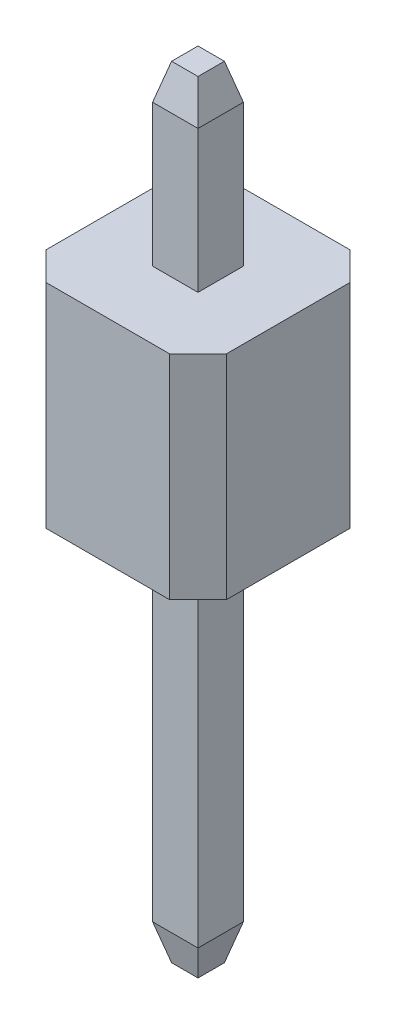
ISO-10303-21;
HEADER;
FILE_DESCRIPTION(('STEP AP214'),'2;1');
FILE_NAME('part.step','',(''),(''),'','','');
FILE_SCHEMA(('AUTOMOTIVE_DESIGN { 1 0 10303 214 1 1 1 1 }'));
ENDSEC;
DATA;
#1=APPLICATION_CONTEXT('core data for automotive mechanical design processes');
#2=APPLICATION_PROTOCOL_DEFINITION('international standard','automotive_design',2000,#1);
#3=PRODUCT_CONTEXT('',#1,'mechanical');
#4=PRODUCT('Part','Part','',(#3));
#5=PRODUCT_RELATED_PRODUCT_CATEGORY('part','',(#4));
#6=PRODUCT_DEFINITION_FORMATION('','',#4);
#7=PRODUCT_DEFINITION_CONTEXT('part definition',#1,'design');
#8=PRODUCT_DEFINITION('design','',#6,#7);
#9=PRODUCT_DEFINITION_SHAPE('','',#8);
#10=(LENGTH_UNIT() NAMED_UNIT(*) SI_UNIT(.MILLI.,.METRE.));
#11=(NAMED_UNIT(*) PLANE_ANGLE_UNIT() SI_UNIT($,.RADIAN.));
#12=(NAMED_UNIT(*) SI_UNIT($,.STERADIAN.) SOLID_ANGLE_UNIT());
#13=UNCERTAINTY_MEASURE_WITH_UNIT(LENGTH_MEASURE(1.E-05),#10,'distance_accuracy_value','');
#14=(GEOMETRIC_REPRESENTATION_CONTEXT(3) GLOBAL_UNCERTAINTY_ASSIGNED_CONTEXT((#13)) GLOBAL_UNIT_ASSIGNED_CONTEXT((#10,
#11,#12)) REPRESENTATION_CONTEXT('',''));
#15=CARTESIAN_POINT('',(0.,0.,0.));
#16=DIRECTION('',(0.,0.,1.));
#17=DIRECTION('',(1.,0.,0.));
#18=AXIS2_PLACEMENT_3D('',#15,#16,#17);
#19=CARTESIAN_POINT('',(1.27,3.,1.27));
#20=DIRECTION('',(-1.,0.,0.));
#21=DIRECTION('',(0.,0.,1.));
#22=AXIS2_PLACEMENT_3D('',#19,#20,#21);
#23=PLANE('',#22);
#24=DIRECTION('',(0.,0.,-1.));
#25=VECTOR('',#24,1.);
#26=CARTESIAN_POINT('',(1.27,0.,1.27));
#27=LINE('',#26,#25);
#28=CARTESIAN_POINT('',(1.27,0.,0.87));
#29=VERTEX_POINT('',#28);
#30=CARTESIAN_POINT('',(1.27,0.,-0.869999999999999));
#31=VERTEX_POINT('',#30);
#32=EDGE_CURVE('E250',#29,#31,#27,.T.);
#33=ORIENTED_EDGE('',*,*,#32,.T.);
#34=DIRECTION('',(0.,1.,0.));
#35=VECTOR('',#34,1.);
#36=CARTESIAN_POINT('',(1.27,3.,-0.869999999999999));
#37=LINE('',#36,#35);
#38=CARTESIAN_POINT('',(1.27,3.,-0.869999999999999));
#39=VERTEX_POINT('',#38);
#40=EDGE_CURVE('E303',#31,#39,#37,.T.);
#41=ORIENTED_EDGE('',*,*,#40,.T.);
#42=DIRECTION('',(0.,0.,-1.));
#43=VECTOR('',#42,1.);
#44=CARTESIAN_POINT('',(1.27,3.,1.27));
#45=LINE('',#44,#43);
#46=CARTESIAN_POINT('',(1.27,3.,0.87));
#47=VERTEX_POINT('',#46);
#48=EDGE_CURVE('E251',#47,#39,#45,.T.);
#49=ORIENTED_EDGE('',*,*,#48,.F.);
#50=DIRECTION('',(0.,-1.,0.));
#51=VECTOR('',#50,1.);
#52=CARTESIAN_POINT('',(1.27,3.,0.87));
#53=LINE('',#52,#51);
#54=EDGE_CURVE('E300',#47,#29,#53,.T.);
#55=ORIENTED_EDGE('',*,*,#54,.T.);
#56=EDGE_LOOP('',(#33,#41,#49,#55));
#57=FACE_BOUND('',#56,.T.);
#58=ADVANCED_FACE('F41',(#57),#23,.F.);
#59=CARTESIAN_POINT('',(-1.27,3.,-1.27));
#60=DIRECTION('',(0.,0.,1.));
#61=DIRECTION('',(1.,0.,0.));
#62=AXIS2_PLACEMENT_3D('',#59,#60,#61);
#63=PLANE('',#62);
#64=DIRECTION('',(-1.,0.,0.));
#65=VECTOR('',#64,1.);
#66=CARTESIAN_POINT('',(-1.27,0.,-1.27));
#67=LINE('',#66,#65);
#68=CARTESIAN_POINT('',(0.87,0.,-1.27));
#69=VERTEX_POINT('',#68);
#70=CARTESIAN_POINT('',(-0.869999999999999,0.,-1.27));
#71=VERTEX_POINT('',#70);
#72=EDGE_CURVE('E267',#69,#71,#67,.T.);
#73=ORIENTED_EDGE('',*,*,#72,.T.);
#74=DIRECTION('',(0.,1.,0.));
#75=VECTOR('',#74,1.);
#76=CARTESIAN_POINT('',(-0.869999999999999,3.,-1.27));
#77=LINE('',#76,#75);
#78=CARTESIAN_POINT('',(-0.869999999999999,3.,-1.27));
#79=VERTEX_POINT('',#78);
#80=EDGE_CURVE('E290',#71,#79,#77,.T.);
#81=ORIENTED_EDGE('',*,*,#80,.T.);
#82=DIRECTION('',(-1.,0.,0.));
#83=VECTOR('',#82,1.);
#84=CARTESIAN_POINT('',(-1.27,3.,-1.27));
#85=LINE('',#84,#83);
#86=CARTESIAN_POINT('',(0.87,3.,-1.27));
#87=VERTEX_POINT('',#86);
#88=EDGE_CURVE('E254',#87,#79,#85,.T.);
#89=ORIENTED_EDGE('',*,*,#88,.F.);
#90=DIRECTION('',(0.,-1.,0.));
#91=VECTOR('',#90,1.);
#92=CARTESIAN_POINT('',(0.87,3.,-1.27));
#93=LINE('',#92,#91);
#94=EDGE_CURVE('E287',#87,#69,#93,.T.);
#95=ORIENTED_EDGE('',*,*,#94,.T.);
#96=EDGE_LOOP('',(#73,#81,#89,#95));
#97=FACE_BOUND('',#96,.T.);
#98=ADVANCED_FACE('F426',(#97),#63,.F.);
#99=CARTESIAN_POINT('',(-1.27,3.,1.27));
#100=DIRECTION('',(1.,0.,0.));
#101=DIRECTION('',(0.,0.,-1.));
#102=AXIS2_PLACEMENT_3D('',#99,#100,#101);
#103=PLANE('',#102);
#104=DIRECTION('',(0.,0.,1.));
#105=VECTOR('',#104,1.);
#106=CARTESIAN_POINT('',(-1.27,3.,1.27));
#107=LINE('',#106,#105);
#108=CARTESIAN_POINT('',(-1.27,3.,-0.87));
#109=VERTEX_POINT('',#108);
#110=CARTESIAN_POINT('',(-1.27,3.,0.87));
#111=VERTEX_POINT('',#110);
#112=EDGE_CURVE('E258',#109,#111,#107,.T.);
#113=ORIENTED_EDGE('',*,*,#112,.F.);
#114=DIRECTION('',(0.,-1.,0.));
#115=VECTOR('',#114,1.);
#116=CARTESIAN_POINT('',(-1.27,3.,-0.87));
#117=LINE('',#116,#115);
#118=CARTESIAN_POINT('',(-1.27,0.,-0.87));
#119=VERTEX_POINT('',#118);
#120=EDGE_CURVE('E276',#109,#119,#117,.T.);
#121=ORIENTED_EDGE('',*,*,#120,.T.);
#122=DIRECTION('',(0.,0.,1.));
#123=VECTOR('',#122,1.);
#124=CARTESIAN_POINT('',(-1.27,0.,1.27));
#125=LINE('',#124,#123);
#126=CARTESIAN_POINT('',(-1.27,0.,0.87));
#127=VERTEX_POINT('',#126);
#128=EDGE_CURVE('E270',#119,#127,#125,.T.);
#129=ORIENTED_EDGE('',*,*,#128,.T.);
#130=DIRECTION('',(0.,1.,0.));
#131=VECTOR('',#130,1.);
#132=CARTESIAN_POINT('',(-1.27,3.,0.87));
#133=LINE('',#132,#131);
#134=EDGE_CURVE('E264',#127,#111,#133,.T.);
#135=ORIENTED_EDGE('',*,*,#134,.T.);
#136=EDGE_LOOP('',(#113,#121,#129,#135));
#137=FACE_BOUND('',#136,.T.);
#138=ADVANCED_FACE('F406',(#137),#103,.F.);
#139=CARTESIAN_POINT('',(-1.27,3.,1.27));
#140=DIRECTION('',(0.,0.,-1.));
#141=DIRECTION('',(-1.,0.,0.));
#142=AXIS2_PLACEMENT_3D('',#139,#140,#141);
#143=PLANE('',#142);
#144=DIRECTION('',(1.,0.,0.));
#145=VECTOR('',#144,1.);
#146=CARTESIAN_POINT('',(-1.27,3.,1.27));
#147=LINE('',#146,#145);
#148=CARTESIAN_POINT('',(-0.870000000000001,3.,1.27));
#149=VERTEX_POINT('',#148);
#150=CARTESIAN_POINT('',(0.869999999999999,3.,1.27));
#151=VERTEX_POINT('',#150);
#152=EDGE_CURVE('E261',#149,#151,#147,.T.);
#153=ORIENTED_EDGE('',*,*,#152,.F.);
#154=DIRECTION('',(0.,-1.,0.));
#155=VECTOR('',#154,1.);
#156=CARTESIAN_POINT('',(-0.870000000000001,3.,1.27));
#157=LINE('',#156,#155);
#158=CARTESIAN_POINT('',(-0.870000000000001,0.,1.27));
#159=VERTEX_POINT('',#158);
#160=EDGE_CURVE('E307',#149,#159,#157,.T.);
#161=ORIENTED_EDGE('',*,*,#160,.T.);
#162=DIRECTION('',(1.,0.,0.));
#163=VECTOR('',#162,1.);
#164=CARTESIAN_POINT('',(-1.27,0.,1.27));
#165=LINE('',#164,#163);
#166=CARTESIAN_POINT('',(0.869999999999999,0.,1.27));
#167=VERTEX_POINT('',#166);
#168=EDGE_CURVE('E255',#159,#167,#165,.T.);
#169=ORIENTED_EDGE('',*,*,#168,.T.);
#170=DIRECTION('',(0.,1.,0.));
#171=VECTOR('',#170,1.);
#172=CARTESIAN_POINT('',(0.869999999999999,3.,1.27));
#173=LINE('',#172,#171);
#174=EDGE_CURVE('E305',#167,#151,#173,.T.);
#175=ORIENTED_EDGE('',*,*,#174,.T.);
#176=EDGE_LOOP('',(#153,#161,#169,#175));
#177=FACE_BOUND('',#176,.T.);
#178=ADVANCED_FACE('F392',(#177),#143,.F.);
#179=CARTESIAN_POINT('',(0.,3.,0.));
#180=DIRECTION('',(0.,-1.,0.));
#181=DIRECTION('',(0.,0.,-1.));
#182=AXIS2_PLACEMENT_3D('',#179,#180,#181);
#183=PLANE('',#182);
#184=DIRECTION('',(1.,0.,0.));
#185=VECTOR('',#184,1.);
#186=CARTESIAN_POINT('',(0.,3.,-0.32));
#187=LINE('',#186,#185);
#188=CARTESIAN_POINT('',(-0.32,3.,-0.32));
#189=VERTEX_POINT('',#188);
#190=CARTESIAN_POINT('',(0.32,3.,-0.32));
#191=VERTEX_POINT('',#190);
#192=EDGE_CURVE('E244',#189,#191,#187,.T.);
#193=ORIENTED_EDGE('',*,*,#192,.T.);
#194=DIRECTION('',(0.,0.,1.));
#195=VECTOR('',#194,1.);
#196=CARTESIAN_POINT('',(0.32,3.,0.));
#197=LINE('',#196,#195);
#198=CARTESIAN_POINT('',(0.32,3.,0.32));
#199=VERTEX_POINT('',#198);
#200=EDGE_CURVE('E247',#191,#199,#197,.T.);
#201=ORIENTED_EDGE('',*,*,#200,.T.);
#202=DIRECTION('',(-1.,0.,0.));
#203=VECTOR('',#202,1.);
#204=CARTESIAN_POINT('',(0.,3.,0.32));
#205=LINE('',#204,#203);
#206=CARTESIAN_POINT('',(-0.32,3.,0.32));
#207=VERTEX_POINT('',#206);
#208=EDGE_CURVE('E230',#199,#207,#205,.T.);
#209=ORIENTED_EDGE('',*,*,#208,.T.);
#210=DIRECTION('',(0.,0.,-1.));
#211=VECTOR('',#210,1.);
#212=CARTESIAN_POINT('',(-0.32,3.,0.));
#213=LINE('',#212,#211);
#214=EDGE_CURVE('E241',#207,#189,#213,.T.);
#215=ORIENTED_EDGE('',*,*,#214,.T.);
#216=EDGE_LOOP('',(#193,#201,#209,#215));
#217=FACE_BOUND('',#216,.T.);
#218=ORIENTED_EDGE('',*,*,#88,.T.);
#219=DIRECTION('',(0.707106781186548,0.,-0.707106781186547));
#220=VECTOR('',#219,1.);
#221=CARTESIAN_POINT('',(-1.27,3.,-0.87));
#222=LINE('',#221,#220);
#223=EDGE_CURVE('E298',#79,#109,#222,.F.);
#224=ORIENTED_EDGE('',*,*,#223,.T.);
#225=ORIENTED_EDGE('',*,*,#112,.T.);
#226=DIRECTION('',(-0.707106781186547,0.,-0.707106781186548));
#227=VECTOR('',#226,1.);
#228=CARTESIAN_POINT('',(-0.870000000000001,3.,1.27));
#229=LINE('',#228,#227);
#230=EDGE_CURVE('E294',#111,#149,#229,.F.);
#231=ORIENTED_EDGE('',*,*,#230,.T.);
#232=ORIENTED_EDGE('',*,*,#152,.T.);
#233=DIRECTION('',(-0.707106781186548,0.,0.707106781186547));
#234=VECTOR('',#233,1.);
#235=CARTESIAN_POINT('',(1.27,3.,0.87));
#236=LINE('',#235,#234);
#237=EDGE_CURVE('E292',#151,#47,#236,.F.);
#238=ORIENTED_EDGE('',*,*,#237,.T.);
#239=ORIENTED_EDGE('',*,*,#48,.T.);
#240=DIRECTION('',(0.707106781186547,0.,0.707106781186548));
#241=VECTOR('',#240,1.);
#242=CARTESIAN_POINT('',(0.87,3.,-1.27));
#243=LINE('',#242,#241);
#244=EDGE_CURVE('E296',#39,#87,#243,.F.);
#245=ORIENTED_EDGE('',*,*,#244,.T.);
#246=EDGE_LOOP('',(#218,#224,#225,#231,#232,#238,#239,#245));
#247=FACE_BOUND('',#246,.T.);
#248=ADVANCED_FACE('F389',(#217,#247),#183,.F.);
#249=CARTESIAN_POINT('',(0.,0.,0.));
#250=DIRECTION('',(0.,-1.,0.));
#251=DIRECTION('',(0.,0.,-1.));
#252=AXIS2_PLACEMENT_3D('',#249,#250,#251);
#253=PLANE('',#252);
#254=DIRECTION('',(0.,0.,1.));
#255=VECTOR('',#254,1.);
#256=CARTESIAN_POINT('',(0.32,0.,0.));
#257=LINE('',#256,#255);
#258=CARTESIAN_POINT('',(0.32,0.,-0.32));
#259=VERTEX_POINT('',#258);
#260=CARTESIAN_POINT('',(0.32,0.,0.32));
#261=VERTEX_POINT('',#260);
#262=EDGE_CURVE('E11',#259,#261,#257,.T.);
#263=ORIENTED_EDGE('',*,*,#262,.F.);
#264=DIRECTION('',(1.,0.,0.));
#265=VECTOR('',#264,1.);
#266=CARTESIAN_POINT('',(0.,0.,-0.32));
#267=LINE('',#266,#265);
#268=CARTESIAN_POINT('',(-0.32,0.,-0.32));
#269=VERTEX_POINT('',#268);
#270=EDGE_CURVE('E50',#269,#259,#267,.T.);
#271=ORIENTED_EDGE('',*,*,#270,.F.);
#272=DIRECTION('',(0.,0.,-1.));
#273=VECTOR('',#272,1.);
#274=CARTESIAN_POINT('',(-0.32,0.,0.));
#275=LINE('',#274,#273);
#276=CARTESIAN_POINT('',(-0.32,0.,0.32));
#277=VERTEX_POINT('',#276);
#278=EDGE_CURVE('E313',#277,#269,#275,.T.);
#279=ORIENTED_EDGE('',*,*,#278,.F.);
#280=DIRECTION('',(-1.,0.,0.));
#281=VECTOR('',#280,1.);
#282=CARTESIAN_POINT('',(0.,0.,0.32));
#283=LINE('',#282,#281);
#284=EDGE_CURVE('E310',#261,#277,#283,.T.);
#285=ORIENTED_EDGE('',*,*,#284,.F.);
#286=EDGE_LOOP('',(#263,#271,#279,#285));
#287=FACE_BOUND('',#286,.T.);
#288=ORIENTED_EDGE('',*,*,#128,.F.);
#289=DIRECTION('',(-0.707106781186548,0.,0.707106781186547));
#290=VECTOR('',#289,1.);
#291=CARTESIAN_POINT('',(-1.07,0.,-1.07));
#292=LINE('',#291,#290);
#293=EDGE_CURVE('E285',#119,#71,#292,.F.);
#294=ORIENTED_EDGE('',*,*,#293,.T.);
#295=ORIENTED_EDGE('',*,*,#72,.F.);
#296=DIRECTION('',(-0.707106781186547,0.,-0.707106781186548));
#297=VECTOR('',#296,1.);
#298=CARTESIAN_POINT('',(1.07,0.,-1.07));
#299=LINE('',#298,#297);
#300=EDGE_CURVE('E283',#69,#31,#299,.F.);
#301=ORIENTED_EDGE('',*,*,#300,.T.);
#302=ORIENTED_EDGE('',*,*,#32,.F.);
#303=DIRECTION('',(0.707106781186548,0.,-0.707106781186547));
#304=VECTOR('',#303,1.);
#305=CARTESIAN_POINT('',(1.07,0.,1.07));
#306=LINE('',#305,#304);
#307=EDGE_CURVE('E279',#29,#167,#306,.F.);
#308=ORIENTED_EDGE('',*,*,#307,.T.);
#309=ORIENTED_EDGE('',*,*,#168,.F.);
#310=DIRECTION('',(0.707106781186547,0.,0.707106781186548));
#311=VECTOR('',#310,1.);
#312=CARTESIAN_POINT('',(-1.07,0.,1.07));
#313=LINE('',#312,#311);
#314=EDGE_CURVE('E281',#159,#127,#313,.F.);
#315=ORIENTED_EDGE('',*,*,#314,.T.);
#316=EDGE_LOOP('',(#288,#294,#295,#301,#302,#308,#309,#315));
#317=FACE_BOUND('',#316,.T.);
#318=ADVANCED_FACE('F319',(#287,#317),#253,.T.);
#319=CARTESIAN_POINT('',(-1.27,3.,-0.87));
#320=DIRECTION('',(0.707106781186547,0.,0.707106781186548));
#321=DIRECTION('',(0.,-1.,0.));
#322=AXIS2_PLACEMENT_3D('',#319,#320,#321);
#323=PLANE('',#322);
#324=ORIENTED_EDGE('',*,*,#223,.F.);
#325=ORIENTED_EDGE('',*,*,#80,.F.);
#326=ORIENTED_EDGE('',*,*,#293,.F.);
#327=ORIENTED_EDGE('',*,*,#120,.F.);
#328=EDGE_LOOP('',(#324,#325,#326,#327));
#329=FACE_BOUND('',#328,.T.);
#330=ADVANCED_FACE('F403',(#329),#323,.F.);
#331=CARTESIAN_POINT('',(0.87,3.,-1.27));
#332=DIRECTION('',(-0.707106781186548,0.,0.707106781186547));
#333=DIRECTION('',(0.,-1.,0.));
#334=AXIS2_PLACEMENT_3D('',#331,#332,#333);
#335=PLANE('',#334);
#336=ORIENTED_EDGE('',*,*,#244,.F.);
#337=ORIENTED_EDGE('',*,*,#40,.F.);
#338=ORIENTED_EDGE('',*,*,#300,.F.);
#339=ORIENTED_EDGE('',*,*,#94,.F.);
#340=EDGE_LOOP('',(#336,#337,#338,#339));
#341=FACE_BOUND('',#340,.T.);
#342=ADVANCED_FACE('F425',(#341),#335,.F.);
#343=CARTESIAN_POINT('',(-0.870000000000001,3.,1.27));
#344=DIRECTION('',(0.707106781186548,0.,-0.707106781186547));
#345=DIRECTION('',(0.,-1.,0.));
#346=AXIS2_PLACEMENT_3D('',#343,#344,#345);
#347=PLANE('',#346);
#348=ORIENTED_EDGE('',*,*,#230,.F.);
#349=ORIENTED_EDGE('',*,*,#134,.F.);
#350=ORIENTED_EDGE('',*,*,#314,.F.);
#351=ORIENTED_EDGE('',*,*,#160,.F.);
#352=EDGE_LOOP('',(#348,#349,#350,#351));
#353=FACE_BOUND('',#352,.T.);
#354=ADVANCED_FACE('F413',(#353),#347,.F.);
#355=CARTESIAN_POINT('',(1.27,3.,0.87));
#356=DIRECTION('',(-0.707106781186547,0.,-0.707106781186548));
#357=DIRECTION('',(0.,-1.,0.));
#358=AXIS2_PLACEMENT_3D('',#355,#356,#357);
#359=PLANE('',#358);
#360=ORIENTED_EDGE('',*,*,#237,.F.);
#361=ORIENTED_EDGE('',*,*,#174,.F.);
#362=ORIENTED_EDGE('',*,*,#307,.F.);
#363=ORIENTED_EDGE('',*,*,#54,.F.);
#364=EDGE_LOOP('',(#360,#361,#362,#363));
#365=FACE_BOUND('',#364,.T.);
#366=ADVANCED_FACE('F44',(#365),#359,.F.);
#367=CARTESIAN_POINT('',(-0.32,5.,0.32));
#368=DIRECTION('',(0.,0.,1.));
#369=DIRECTION('',(1.,0.,0.));
#370=AXIS2_PLACEMENT_3D('',#367,#368,#369);
#371=PLANE('',#370);
#372=DIRECTION('',(0.,-1.,0.));
#373=VECTOR('',#372,1.);
#374=CARTESIAN_POINT('',(0.32,5.,0.32));
#375=LINE('',#374,#373);
#376=CARTESIAN_POINT('',(0.32,-5.,0.32));
#377=VERTEX_POINT('',#376);
#378=EDGE_CURVE('E183',#261,#377,#375,.T.);
#379=ORIENTED_EDGE('',*,*,#378,.F.);
#380=ORIENTED_EDGE('',*,*,#284,.T.);
#381=DIRECTION('',(0.,-1.,0.));
#382=VECTOR('',#381,1.);
#383=CARTESIAN_POINT('',(-0.32,5.,0.32));
#384=LINE('',#383,#382);
#385=CARTESIAN_POINT('',(-0.32,-5.,0.32));
#386=VERTEX_POINT('',#385);
#387=EDGE_CURVE('E235',#277,#386,#384,.T.);
#388=ORIENTED_EDGE('',*,*,#387,.T.);
#389=DIRECTION('',(-1.,0.,0.));
#390=VECTOR('',#389,1.);
#391=CARTESIAN_POINT('',(-0.32,-5.,0.32));
#392=LINE('',#391,#390);
#393=EDGE_CURVE('E187',#377,#386,#392,.T.);
#394=ORIENTED_EDGE('',*,*,#393,.F.);
#395=EDGE_LOOP('',(#379,#380,#388,#394));
#396=FACE_BOUND('',#395,.T.);
#397=ADVANCED_FACE('F322',(#396),#371,.T.);
#398=CARTESIAN_POINT('',(-0.32,5.,0.32));
#399=DIRECTION('',(-1.,0.,0.));
#400=DIRECTION('',(0.,0.,1.));
#401=AXIS2_PLACEMENT_3D('',#398,#399,#400);
#402=PLANE('',#401);
#403=ORIENTED_EDGE('',*,*,#387,.F.);
#404=ORIENTED_EDGE('',*,*,#278,.T.);
#405=DIRECTION('',(0.,-1.,0.));
#406=VECTOR('',#405,1.);
#407=CARTESIAN_POINT('',(-0.32,5.,-0.32));
#408=LINE('',#407,#406);
#409=CARTESIAN_POINT('',(-0.32,-5.,-0.32));
#410=VERTEX_POINT('',#409);
#411=EDGE_CURVE('E233',#269,#410,#408,.T.);
#412=ORIENTED_EDGE('',*,*,#411,.T.);
#413=DIRECTION('',(0.,0.,-1.));
#414=VECTOR('',#413,1.);
#415=CARTESIAN_POINT('',(-0.32,-5.,0.32));
#416=LINE('',#415,#414);
#417=EDGE_CURVE('E214',#386,#410,#416,.T.);
#418=ORIENTED_EDGE('',*,*,#417,.F.);
#419=EDGE_LOOP('',(#403,#404,#412,#418));
#420=FACE_BOUND('',#419,.T.);
#421=ADVANCED_FACE('F317',(#420),#402,.T.);
#422=CARTESIAN_POINT('',(-0.32,5.,-0.32));
#423=DIRECTION('',(0.,0.,-1.));
#424=DIRECTION('',(-1.,0.,0.));
#425=AXIS2_PLACEMENT_3D('',#422,#423,#424);
#426=PLANE('',#425);
#427=ORIENTED_EDGE('',*,*,#411,.F.);
#428=ORIENTED_EDGE('',*,*,#270,.T.);
#429=DIRECTION('',(0.,-1.,0.));
#430=VECTOR('',#429,1.);
#431=CARTESIAN_POINT('',(0.32,5.,-0.32));
#432=LINE('',#431,#430);
#433=CARTESIAN_POINT('',(0.32,-5.,-0.32));
#434=VERTEX_POINT('',#433);
#435=EDGE_CURVE('E181',#259,#434,#432,.T.);
#436=ORIENTED_EDGE('',*,*,#435,.T.);
#437=DIRECTION('',(1.,0.,0.));
#438=VECTOR('',#437,1.);
#439=CARTESIAN_POINT('',(-0.32,-5.,-0.32));
#440=LINE('',#439,#438);
#441=EDGE_CURVE('E195',#410,#434,#440,.T.);
#442=ORIENTED_EDGE('',*,*,#441,.F.);
#443=EDGE_LOOP('',(#427,#428,#436,#442));
#444=FACE_BOUND('',#443,.T.);
#445=ADVANCED_FACE('F193',(#444),#426,.T.);
#446=CARTESIAN_POINT('',(0.32,5.,0.32));
#447=DIRECTION('',(1.,0.,0.));
#448=DIRECTION('',(0.,0.,-1.));
#449=AXIS2_PLACEMENT_3D('',#446,#447,#448);
#450=PLANE('',#449);
#451=ORIENTED_EDGE('',*,*,#435,.F.);
#452=ORIENTED_EDGE('',*,*,#262,.T.);
#453=ORIENTED_EDGE('',*,*,#378,.T.);
#454=DIRECTION('',(0.,0.,1.));
#455=VECTOR('',#454,1.);
#456=CARTESIAN_POINT('',(0.32,-5.,0.32));
#457=LINE('',#456,#455);
#458=EDGE_CURVE('E178',#434,#377,#457,.T.);
#459=ORIENTED_EDGE('',*,*,#458,.F.);
#460=EDGE_LOOP('',(#451,#452,#453,#459));
#461=FACE_BOUND('',#460,.T.);
#462=ADVANCED_FACE('F180',(#461),#450,.T.);
#463=ORIENTED_EDGE('',*,*,#200,.F.);
#464=CARTESIAN_POINT('',(0.32,5.,-0.32));
#465=VERTEX_POINT('',#464);
#466=EDGE_CURVE('E197',#465,#191,#432,.T.);
#467=ORIENTED_EDGE('',*,*,#466,.F.);
#468=DIRECTION('',(0.,0.,1.));
#469=VECTOR('',#468,1.);
#470=CARTESIAN_POINT('',(0.32,5.,0.32));
#471=LINE('',#470,#469);
#472=CARTESIAN_POINT('',(0.32,5.,0.32));
#473=VERTEX_POINT('',#472);
#474=EDGE_CURVE('E213',#465,#473,#471,.T.);
#475=ORIENTED_EDGE('',*,*,#474,.T.);
#476=EDGE_CURVE('E236',#473,#199,#375,.T.);
#477=ORIENTED_EDGE('',*,*,#476,.T.);
#478=EDGE_LOOP('',(#463,#467,#475,#477));
#479=FACE_BOUND('',#478,.T.);
#480=ADVANCED_FACE('F387',(#479),#450,.T.);
#481=ORIENTED_EDGE('',*,*,#192,.F.);
#482=CARTESIAN_POINT('',(-0.32,5.,-0.32));
#483=VERTEX_POINT('',#482);
#484=EDGE_CURVE('E198',#483,#189,#408,.T.);
#485=ORIENTED_EDGE('',*,*,#484,.F.);
#486=DIRECTION('',(1.,0.,0.));
#487=VECTOR('',#486,1.);
#488=CARTESIAN_POINT('',(-0.32,5.,-0.32));
#489=LINE('',#488,#487);
#490=EDGE_CURVE('E226',#483,#465,#489,.T.);
#491=ORIENTED_EDGE('',*,*,#490,.T.);
#492=ORIENTED_EDGE('',*,*,#466,.T.);
#493=EDGE_LOOP('',(#481,#485,#491,#492));
#494=FACE_BOUND('',#493,.T.);
#495=ADVANCED_FACE('F382',(#494),#426,.T.);
#496=ORIENTED_EDGE('',*,*,#214,.F.);
#497=CARTESIAN_POINT('',(-0.32,5.,0.32));
#498=VERTEX_POINT('',#497);
#499=EDGE_CURVE('E57',#498,#207,#384,.T.);
#500=ORIENTED_EDGE('',*,*,#499,.F.);
#501=DIRECTION('',(0.,0.,-1.));
#502=VECTOR('',#501,1.);
#503=CARTESIAN_POINT('',(-0.32,5.,0.32));
#504=LINE('',#503,#502);
#505=EDGE_CURVE('E223',#498,#483,#504,.T.);
#506=ORIENTED_EDGE('',*,*,#505,.T.);
#507=ORIENTED_EDGE('',*,*,#484,.T.);
#508=EDGE_LOOP('',(#496,#500,#506,#507));
#509=FACE_BOUND('',#508,.T.);
#510=ADVANCED_FACE('F384',(#509),#402,.T.);
#511=ORIENTED_EDGE('',*,*,#208,.F.);
#512=ORIENTED_EDGE('',*,*,#476,.F.);
#513=DIRECTION('',(-1.,0.,0.));
#514=VECTOR('',#513,1.);
#515=CARTESIAN_POINT('',(-0.32,5.,0.32));
#516=LINE('',#515,#514);
#517=EDGE_CURVE('E217',#473,#498,#516,.T.);
#518=ORIENTED_EDGE('',*,*,#517,.T.);
#519=ORIENTED_EDGE('',*,*,#499,.T.);
#520=EDGE_LOOP('',(#511,#512,#518,#519));
#521=FACE_BOUND('',#520,.T.);
#522=ADVANCED_FACE('F385',(#521),#371,.T.);
#523=CARTESIAN_POINT('',(-0.32,5.,0.32));
#524=DIRECTION('',(0.,0.258819045102521,0.965925826289068));
#525=DIRECTION('',(0.,-0.965925826289068,0.258819045102521));
#526=AXIS2_PLACEMENT_3D('',#523,#524,#525);
#527=PLANE('',#526);
#528=ORIENTED_EDGE('',*,*,#517,.F.);
#529=DIRECTION('',(0.250562807085732,-0.935113126531029,0.250562807085732));
#530=VECTOR('',#529,1.);
#531=CARTESIAN_POINT('',(0.32,5.,0.32));
#532=LINE('',#531,#530);
#533=CARTESIAN_POINT('',(0.186025403784438,5.5,0.186025403784438));
#534=VERTEX_POINT('',#533);
#535=EDGE_CURVE('E188',#534,#473,#532,.T.);
#536=ORIENTED_EDGE('',*,*,#535,.F.);
#537=DIRECTION('',(-1.,0.,0.));
#538=VECTOR('',#537,1.);
#539=CARTESIAN_POINT('',(-0.32,5.5,0.186025403784438));
#540=LINE('',#539,#538);
#541=CARTESIAN_POINT('',(-0.186025403784438,5.5,0.186025403784438));
#542=VERTEX_POINT('',#541);
#543=EDGE_CURVE('E352',#542,#534,#540,.F.);
#544=ORIENTED_EDGE('',*,*,#543,.F.);
#545=DIRECTION('',(-0.250562807085732,-0.935113126531029,0.250562807085732));
#546=VECTOR('',#545,1.);
#547=CARTESIAN_POINT('',(-0.32,5.,0.32));
#548=LINE('',#547,#546);
#549=EDGE_CURVE('E344',#542,#498,#548,.T.);
#550=ORIENTED_EDGE('',*,*,#549,.T.);
#551=EDGE_LOOP('',(#528,#536,#544,#550));
#552=FACE_BOUND('',#551,.T.);
#553=ADVANCED_FACE('F372',(#552),#527,.T.);
#554=CARTESIAN_POINT('',(0.32,5.,0.32));
#555=DIRECTION('',(0.965925826289068,0.258819045102521,0.));
#556=DIRECTION('',(-0.258819045102521,0.965925826289068,0.));
#557=AXIS2_PLACEMENT_3D('',#554,#555,#556);
#558=PLANE('',#557);
#559=ORIENTED_EDGE('',*,*,#474,.F.);
#560=DIRECTION('',(0.250562807085732,-0.935113126531029,-0.250562807085732));
#561=VECTOR('',#560,1.);
#562=CARTESIAN_POINT('',(0.32,5.,-0.32));
#563=LINE('',#562,#561);
#564=CARTESIAN_POINT('',(0.186025403784438,5.5,-0.186025403784438));
#565=VERTEX_POINT('',#564);
#566=EDGE_CURVE('E343',#565,#465,#563,.T.);
#567=ORIENTED_EDGE('',*,*,#566,.F.);
#568=DIRECTION('',(0.,0.,1.));
#569=VECTOR('',#568,1.);
#570=CARTESIAN_POINT('',(0.186025403784438,5.5,0.32));
#571=LINE('',#570,#569);
#572=EDGE_CURVE('E355',#534,#565,#571,.F.);
#573=ORIENTED_EDGE('',*,*,#572,.F.);
#574=ORIENTED_EDGE('',*,*,#535,.T.);
#575=EDGE_LOOP('',(#559,#567,#573,#574));
#576=FACE_BOUND('',#575,.T.);
#577=ADVANCED_FACE('F375',(#576),#558,.T.);
#578=CARTESIAN_POINT('',(0.32,5.,-0.32));
#579=DIRECTION('',(0.,0.258819045102521,-0.965925826289068));
#580=DIRECTION('',(0.,0.965925826289068,0.258819045102521));
#581=AXIS2_PLACEMENT_3D('',#578,#579,#580);
#582=PLANE('',#581);
#583=ORIENTED_EDGE('',*,*,#490,.F.);
#584=DIRECTION('',(-0.250562807085732,-0.935113126531029,-0.250562807085732));
#585=VECTOR('',#584,1.);
#586=CARTESIAN_POINT('',(-0.32,5.,-0.32));
#587=LINE('',#586,#585);
#588=CARTESIAN_POINT('',(-0.186025403784439,5.5,-0.186025403784438));
#589=VERTEX_POINT('',#588);
#590=EDGE_CURVE('E346',#589,#483,#587,.T.);
#591=ORIENTED_EDGE('',*,*,#590,.F.);
#592=DIRECTION('',(1.,0.,0.));
#593=VECTOR('',#592,1.);
#594=CARTESIAN_POINT('',(0.32,5.5,-0.186025403784438));
#595=LINE('',#594,#593);
#596=EDGE_CURVE('E357',#565,#589,#595,.F.);
#597=ORIENTED_EDGE('',*,*,#596,.F.);
#598=ORIENTED_EDGE('',*,*,#566,.T.);
#599=EDGE_LOOP('',(#583,#591,#597,#598));
#600=FACE_BOUND('',#599,.T.);
#601=ADVANCED_FACE('F379',(#600),#582,.T.);
#602=CARTESIAN_POINT('',(-0.32,5.,-0.32));
#603=DIRECTION('',(-0.965925826289068,0.258819045102521,0.));
#604=DIRECTION('',(-0.258819045102521,-0.965925826289068,0.));
#605=AXIS2_PLACEMENT_3D('',#602,#603,#604);
#606=PLANE('',#605);
#607=ORIENTED_EDGE('',*,*,#505,.F.);
#608=ORIENTED_EDGE('',*,*,#549,.F.);
#609=DIRECTION('',(0.,0.,-1.));
#610=VECTOR('',#609,1.);
#611=CARTESIAN_POINT('',(-0.186025403784439,5.5,-0.32));
#612=LINE('',#611,#610);
#613=EDGE_CURVE('E347',#589,#542,#612,.F.);
#614=ORIENTED_EDGE('',*,*,#613,.F.);
#615=ORIENTED_EDGE('',*,*,#590,.T.);
#616=EDGE_LOOP('',(#607,#608,#614,#615));
#617=FACE_BOUND('',#616,.T.);
#618=ADVANCED_FACE('F369',(#617),#606,.T.);
#619=CARTESIAN_POINT('',(0.,5.5,0.));
#620=DIRECTION('',(0.,1.,0.));
#621=DIRECTION('',(0.,0.,1.));
#622=AXIS2_PLACEMENT_3D('',#619,#620,#621);
#623=PLANE('',#622);
#624=ORIENTED_EDGE('',*,*,#543,.T.);
#625=ORIENTED_EDGE('',*,*,#572,.T.);
#626=ORIENTED_EDGE('',*,*,#596,.T.);
#627=ORIENTED_EDGE('',*,*,#613,.T.);
#628=EDGE_LOOP('',(#624,#625,#626,#627));
#629=FACE_BOUND('',#628,.T.);
#630=ADVANCED_FACE('F362',(#629),#623,.T.);
#631=CARTESIAN_POINT('',(-0.32,-5.,0.32));
#632=DIRECTION('',(0.,-0.258819045102521,0.965925826289068));
#633=DIRECTION('',(0.,-0.965925826289068,-0.258819045102521));
#634=AXIS2_PLACEMENT_3D('',#631,#632,#633);
#635=PLANE('',#634);
#636=ORIENTED_EDGE('',*,*,#393,.T.);
#637=DIRECTION('',(-0.250562807085732,0.935113126531029,0.250562807085732));
#638=VECTOR('',#637,1.);
#639=CARTESIAN_POINT('',(-0.279819699011404,-5.14995492475285,0.279819699011404));
#640=LINE('',#639,#638);
#641=CARTESIAN_POINT('',(-0.186025403784438,-5.5,0.186025403784438));
#642=VERTEX_POINT('',#641);
#643=EDGE_CURVE('E334',#642,#386,#640,.T.);
#644=ORIENTED_EDGE('',*,*,#643,.F.);
#645=DIRECTION('',(1.,0.,0.));
#646=VECTOR('',#645,1.);
#647=CARTESIAN_POINT('',(-0.32,-5.5,0.186025403784438));
#648=LINE('',#647,#646);
#649=CARTESIAN_POINT('',(0.186025403784438,-5.5,0.186025403784438));
#650=VERTEX_POINT('',#649);
#651=EDGE_CURVE('E329',#642,#650,#648,.T.);
#652=ORIENTED_EDGE('',*,*,#651,.T.);
#653=DIRECTION('',(0.250562807085732,0.935113126531029,0.250562807085732));
#654=VECTOR('',#653,1.);
#655=CARTESIAN_POINT('',(0.279819699011404,-5.14995492475285,0.279819699011404));
#656=LINE('',#655,#654);
#657=EDGE_CURVE('E209',#650,#377,#656,.T.);
#658=ORIENTED_EDGE('',*,*,#657,.T.);
#659=EDGE_LOOP('',(#636,#644,#652,#658));
#660=FACE_BOUND('',#659,.T.);
#661=ADVANCED_FACE('F327',(#660),#635,.T.);
#662=CARTESIAN_POINT('',(-0.32,-5.,-0.32));
#663=DIRECTION('',(-0.965925826289068,-0.258819045102521,0.));
#664=DIRECTION('',(0.258819045102521,-0.965925826289068,0.));
#665=AXIS2_PLACEMENT_3D('',#662,#663,#664);
#666=PLANE('',#665);
#667=ORIENTED_EDGE('',*,*,#417,.T.);
#668=DIRECTION('',(-0.250562807085732,0.935113126531029,-0.250562807085732));
#669=VECTOR('',#668,1.);
#670=CARTESIAN_POINT('',(-0.279819699011404,-5.14995492475285,-0.279819699011404));
#671=LINE('',#670,#669);
#672=CARTESIAN_POINT('',(-0.186025403784439,-5.5,-0.186025403784438));
#673=VERTEX_POINT('',#672);
#674=EDGE_CURVE('E208',#673,#410,#671,.T.);
#675=ORIENTED_EDGE('',*,*,#674,.F.);
#676=DIRECTION('',(0.,0.,1.));
#677=VECTOR('',#676,1.);
#678=CARTESIAN_POINT('',(-0.186025403784439,-5.5,-0.32));
#679=LINE('',#678,#677);
#680=EDGE_CURVE('E338',#673,#642,#679,.T.);
#681=ORIENTED_EDGE('',*,*,#680,.T.);
#682=ORIENTED_EDGE('',*,*,#643,.T.);
#683=EDGE_LOOP('',(#667,#675,#681,#682));
#684=FACE_BOUND('',#683,.T.);
#685=ADVANCED_FACE('F482',(#684),#666,.T.);
#686=CARTESIAN_POINT('',(0.32,-5.,-0.32));
#687=DIRECTION('',(0.,-0.258819045102521,-0.965925826289068));
#688=DIRECTION('',(0.,0.965925826289068,-0.258819045102521));
#689=AXIS2_PLACEMENT_3D('',#686,#687,#688);
#690=PLANE('',#689);
#691=ORIENTED_EDGE('',*,*,#441,.T.);
#692=DIRECTION('',(0.250562807085732,0.935113126531029,-0.250562807085732));
#693=VECTOR('',#692,1.);
#694=CARTESIAN_POINT('',(0.279819699011404,-5.14995492475285,-0.279819699011404));
#695=LINE('',#694,#693);
#696=CARTESIAN_POINT('',(0.186025403784438,-5.5,-0.186025403784438));
#697=VERTEX_POINT('',#696);
#698=EDGE_CURVE('E201',#697,#434,#695,.T.);
#699=ORIENTED_EDGE('',*,*,#698,.F.);
#700=DIRECTION('',(-1.,0.,0.));
#701=VECTOR('',#700,1.);
#702=CARTESIAN_POINT('',(0.32,-5.5,-0.186025403784438));
#703=LINE('',#702,#701);
#704=EDGE_CURVE('E331',#697,#673,#703,.T.);
#705=ORIENTED_EDGE('',*,*,#704,.T.);
#706=ORIENTED_EDGE('',*,*,#674,.T.);
#707=EDGE_LOOP('',(#691,#699,#705,#706));
#708=FACE_BOUND('',#707,.T.);
#709=ADVANCED_FACE('F211',(#708),#690,.T.);
#710=CARTESIAN_POINT('',(0.32,-5.,0.32));
#711=DIRECTION('',(0.965925826289068,-0.258819045102521,0.));
#712=DIRECTION('',(0.258819045102521,0.965925826289068,0.));
#713=AXIS2_PLACEMENT_3D('',#710,#711,#712);
#714=PLANE('',#713);
#715=ORIENTED_EDGE('',*,*,#458,.T.);
#716=ORIENTED_EDGE('',*,*,#657,.F.);
#717=DIRECTION('',(0.,0.,-1.));
#718=VECTOR('',#717,1.);
#719=CARTESIAN_POINT('',(0.186025403784438,-5.5,0.32));
#720=LINE('',#719,#718);
#721=EDGE_CURVE('E204',#650,#697,#720,.T.);
#722=ORIENTED_EDGE('',*,*,#721,.T.);
#723=ORIENTED_EDGE('',*,*,#698,.T.);
#724=EDGE_LOOP('',(#715,#716,#722,#723));
#725=FACE_BOUND('',#724,.T.);
#726=ADVANCED_FACE('F202',(#725),#714,.T.);
#727=CARTESIAN_POINT('',(0.,-5.5,0.));
#728=DIRECTION('',(0.,-1.,0.));
#729=DIRECTION('',(0.,0.,1.));
#730=AXIS2_PLACEMENT_3D('',#727,#728,#729);
#731=PLANE('',#730);
#732=ORIENTED_EDGE('',*,*,#651,.F.);
#733=ORIENTED_EDGE('',*,*,#680,.F.);
#734=ORIENTED_EDGE('',*,*,#704,.F.);
#735=ORIENTED_EDGE('',*,*,#721,.F.);
#736=EDGE_LOOP('',(#732,#733,#734,#735));
#737=FACE_BOUND('',#736,.T.);
#738=ADVANCED_FACE('F490',(#737),#731,.T.);
#739=CLOSED_SHELL('',(#58,#98,#138,#178,#248,#318,#330,#342,#354,#366,#397,#421,#445,#462,#480,
#495,#510,#522,#553,#577,#601,#618,#630,#661,#685,#709,#726,#738));
#740=MANIFOLD_SOLID_BREP('B2',#739);
#741=ADVANCED_BREP_SHAPE_REPRESENTATION('',(#18,#740),#14);
#742=SHAPE_DEFINITION_REPRESENTATION(#9,#741);
ENDSEC;
END-ISO-10303-21;
